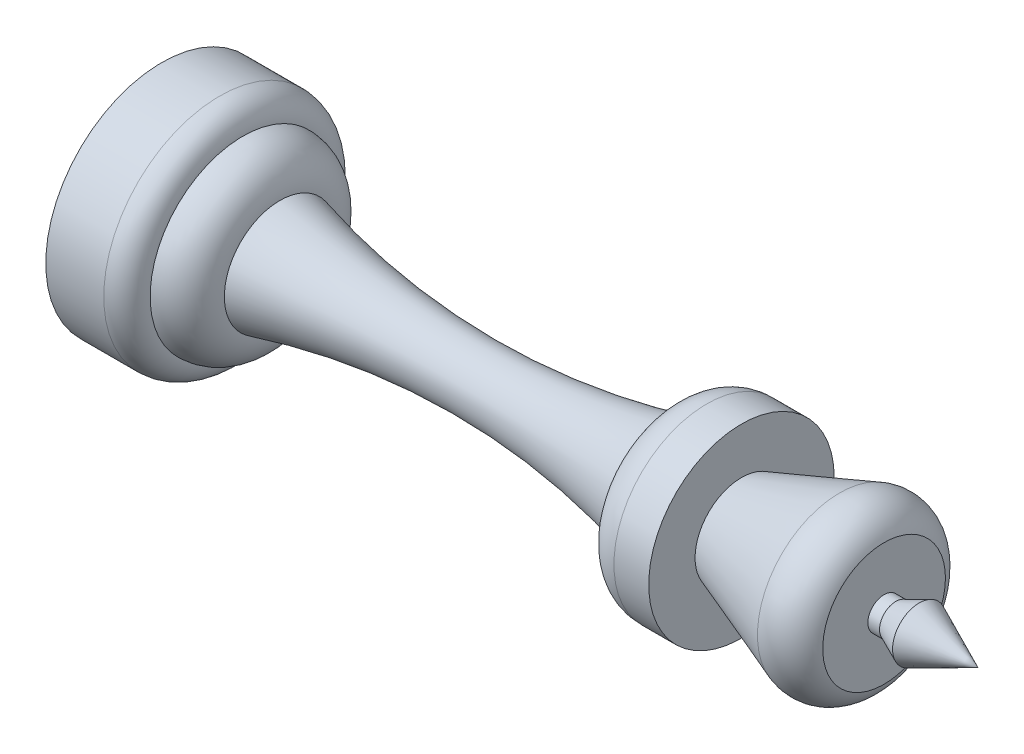
ISO-10303-21;
HEADER;
FILE_DESCRIPTION(('STEP AP214'),'2;1');
FILE_NAME('part.step','',(''),(''),'','','');
FILE_SCHEMA(('AUTOMOTIVE_DESIGN { 1 0 10303 214 1 1 1 1 }'));
ENDSEC;
DATA;
#1=APPLICATION_CONTEXT('core data for automotive mechanical design processes');
#2=APPLICATION_PROTOCOL_DEFINITION('international standard','automotive_design',2000,#1);
#3=PRODUCT_CONTEXT('',#1,'mechanical');
#4=PRODUCT('Part','Part','',(#3));
#5=PRODUCT_RELATED_PRODUCT_CATEGORY('part','',(#4));
#6=PRODUCT_DEFINITION_FORMATION('','',#4);
#7=PRODUCT_DEFINITION_CONTEXT('part definition',#1,'design');
#8=PRODUCT_DEFINITION('design','',#6,#7);
#9=PRODUCT_DEFINITION_SHAPE('','',#8);
#10=(LENGTH_UNIT() NAMED_UNIT(*) SI_UNIT(.MILLI.,.METRE.));
#11=(NAMED_UNIT(*) PLANE_ANGLE_UNIT() SI_UNIT($,.RADIAN.));
#12=(NAMED_UNIT(*) SI_UNIT($,.STERADIAN.) SOLID_ANGLE_UNIT());
#13=UNCERTAINTY_MEASURE_WITH_UNIT(LENGTH_MEASURE(1.E-05),#10,'distance_accuracy_value','');
#14=(GEOMETRIC_REPRESENTATION_CONTEXT(3) GLOBAL_UNCERTAINTY_ASSIGNED_CONTEXT((#13)) GLOBAL_UNIT_ASSIGNED_CONTEXT((#10,
#11,#12)) REPRESENTATION_CONTEXT('',''));
#15=CARTESIAN_POINT('',(0.,0.,0.));
#16=DIRECTION('',(0.,0.,1.));
#17=DIRECTION('',(1.,0.,0.));
#18=AXIS2_PLACEMENT_3D('',#15,#16,#17);
#19=CARTESIAN_POINT('',(7.,0.,0.));
#20=DIRECTION('',(1.,0.,0.));
#21=DIRECTION('',(0.,0.,-1.));
#22=AXIS2_PLACEMENT_3D('',#19,#20,#21);
#23=TOROIDAL_SURFACE('',#22,4.8,3.2);
#24=CARTESIAN_POINT('',(10.2,0.,0.));
#25=DIRECTION('',(1.,0.,0.));
#26=DIRECTION('',(0.,0.,-1.));
#27=AXIS2_PLACEMENT_3D('',#24,#25,#26);
#28=CIRCLE('',#27,4.8);
#29=CARTESIAN_POINT('',(10.2,0.,-4.8));
#30=VERTEX_POINT('',#29);
#31=EDGE_CURVE('E57',#30,#30,#28,.T.);
#32=ORIENTED_EDGE('',*,*,#31,.F.);
#33=EDGE_LOOP('',(#32));
#34=FACE_BOUND('',#33,.T.);
#35=CARTESIAN_POINT('',(7.,0.,0.));
#36=DIRECTION('',(1.,0.,0.));
#37=DIRECTION('',(0.,0.,-1.));
#38=AXIS2_PLACEMENT_3D('',#35,#36,#37);
#39=CIRCLE('',#38,8.);
#40=CARTESIAN_POINT('',(7.,0.,-8.));
#41=VERTEX_POINT('',#40);
#42=EDGE_CURVE('E111',#41,#41,#39,.T.);
#43=ORIENTED_EDGE('',*,*,#42,.T.);
#44=EDGE_LOOP('',(#43));
#45=FACE_BOUND('',#44,.T.);
#46=ADVANCED_FACE('F48',(#34,#45),#23,.T.);
#47=CARTESIAN_POINT('',(5.,0.,0.));
#48=DIRECTION('',(1.,0.,0.));
#49=DIRECTION('',(0.,0.,-1.));
#50=AXIS2_PLACEMENT_3D('',#47,#48,#49);
#51=TOROIDAL_SURFACE('',#50,8.,2.);
#52=ORIENTED_EDGE('',*,*,#42,.F.);
#53=EDGE_LOOP('',(#52));
#54=FACE_BOUND('',#53,.T.);
#55=CARTESIAN_POINT('',(5.,0.,0.));
#56=DIRECTION('',(1.,0.,0.));
#57=DIRECTION('',(0.,0.,-1.));
#58=AXIS2_PLACEMENT_3D('',#55,#56,#57);
#59=CIRCLE('',#58,10.);
#60=CARTESIAN_POINT('',(5.,0.,-10.));
#61=VERTEX_POINT('',#60);
#62=EDGE_CURVE('E107',#61,#61,#59,.T.);
#63=ORIENTED_EDGE('',*,*,#62,.T.);
#64=EDGE_LOOP('',(#63));
#65=FACE_BOUND('',#64,.T.);
#66=ADVANCED_FACE('F121',(#54,#65),#51,.T.);
#67=CARTESIAN_POINT('',(5.,0.,0.));
#68=DIRECTION('',(1.,0.,0.));
#69=DIRECTION('',(0.,0.,-1.));
#70=AXIS2_PLACEMENT_3D('',#67,#68,#69);
#71=CYLINDRICAL_SURFACE('',#70,10.);
#72=ORIENTED_EDGE('',*,*,#62,.F.);
#73=EDGE_LOOP('',(#72));
#74=FACE_BOUND('',#73,.T.);
#75=CARTESIAN_POINT('',(0.,0.,0.));
#76=DIRECTION('',(1.,0.,0.));
#77=DIRECTION('',(0.,0.,-1.));
#78=AXIS2_PLACEMENT_3D('',#75,#76,#77);
#79=CIRCLE('',#78,10.);
#80=CARTESIAN_POINT('',(0.,0.,-10.));
#81=VERTEX_POINT('',#80);
#82=EDGE_CURVE('E103',#81,#81,#79,.T.);
#83=ORIENTED_EDGE('',*,*,#82,.T.);
#84=EDGE_LOOP('',(#83));
#85=FACE_BOUND('',#84,.T.);
#86=ADVANCED_FACE('F127',(#74,#85),#71,.T.);
#87=CARTESIAN_POINT('',(0.,0.,0.));
#88=DIRECTION('',(1.,0.,0.));
#89=DIRECTION('',(0.,0.,-1.));
#90=AXIS2_PLACEMENT_3D('',#87,#88,#89);
#91=PLANE('',#90);
#92=ORIENTED_EDGE('',*,*,#82,.F.);
#93=EDGE_LOOP('',(#92));
#94=FACE_BOUND('',#93,.T.);
#95=ADVANCED_FACE('F133',(#94),#91,.F.);
#96=CARTESIAN_POINT('',(59.4832940170502,0.,0.));
#97=DIRECTION('',(1.,0.,0.));
#98=DIRECTION('',(0.,0.,-1.));
#99=AXIS2_PLACEMENT_3D('',#96,#97,#98);
#100=TOROIDAL_SURFACE('',#99,4.25910342757333,3.);
#101=CARTESIAN_POINT('',(62.3,0.,0.));
#102=DIRECTION('',(1.,0.,0.));
#103=DIRECTION('',(0.,0.,-1.));
#104=AXIS2_PLACEMENT_3D('',#101,#102,#103);
#105=CIRCLE('',#104,5.29165725455507);
#106=CARTESIAN_POINT('',(62.3,0.,-5.29165725455507));
#107=VERTEX_POINT('',#106);
#108=EDGE_CURVE('E274',#107,#107,#105,.T.);
#109=ORIENTED_EDGE('',*,*,#108,.F.);
#110=EDGE_LOOP('',(#109));
#111=FACE_BOUND('',#110,.T.);
#112=CARTESIAN_POINT('',(58.4572335870732,0.,0.));
#113=DIRECTION('',(1.,0.,0.));
#114=DIRECTION('',(0.,0.,-1.));
#115=AXIS2_PLACEMENT_3D('',#112,#113,#114);
#116=CIRCLE('',#115,7.07818128993106);
#117=CARTESIAN_POINT('',(58.4572335870732,0.,-7.07818128993106));
#118=VERTEX_POINT('',#117);
#119=EDGE_CURVE('E95',#118,#118,#116,.T.);
#120=ORIENTED_EDGE('',*,*,#119,.T.);
#121=EDGE_LOOP('',(#120));
#122=FACE_BOUND('',#121,.T.);
#123=ADVANCED_FACE('F138',(#111,#122),#100,.T.);
#124=CARTESIAN_POINT('',(50.,0.,0.));
#125=DIRECTION('',(1.,0.,0.));
#126=DIRECTION('',(0.,0.,-1.));
#127=AXIS2_PLACEMENT_3D('',#124,#125,#126);
#128=CONICAL_SURFACE('',#127,4.,0.34906585039887);
#129=ORIENTED_EDGE('',*,*,#119,.F.);
#130=EDGE_LOOP('',(#129));
#131=FACE_BOUND('',#130,.T.);
#132=CARTESIAN_POINT('',(50.,0.,0.));
#133=DIRECTION('',(1.,0.,0.));
#134=DIRECTION('',(0.,0.,-1.));
#135=AXIS2_PLACEMENT_3D('',#132,#133,#134);
#136=CIRCLE('',#135,4.);
#137=CARTESIAN_POINT('',(50.,0.,-4.));
#138=VERTEX_POINT('',#137);
#139=EDGE_CURVE('E91',#138,#138,#136,.T.);
#140=ORIENTED_EDGE('',*,*,#139,.T.);
#141=EDGE_LOOP('',(#140));
#142=FACE_BOUND('',#141,.T.);
#143=ADVANCED_FACE('F144',(#131,#142),#128,.T.);
#144=CARTESIAN_POINT('',(50.,0.,0.));
#145=DIRECTION('',(-1.,0.,0.));
#146=DIRECTION('',(0.,0.,1.));
#147=AXIS2_PLACEMENT_3D('',#144,#145,#146);
#148=PLANE('',#147);
#149=ORIENTED_EDGE('',*,*,#139,.F.);
#150=EDGE_LOOP('',(#149));
#151=FACE_BOUND('',#150,.T.);
#152=CARTESIAN_POINT('',(50.,0.,0.));
#153=DIRECTION('',(1.,0.,0.));
#154=DIRECTION('',(0.,0.,-1.));
#155=AXIS2_PLACEMENT_3D('',#152,#153,#154);
#156=CIRCLE('',#155,8.);
#157=CARTESIAN_POINT('',(50.,0.,-8.));
#158=VERTEX_POINT('',#157);
#159=EDGE_CURVE('E87',#158,#158,#156,.T.);
#160=ORIENTED_EDGE('',*,*,#159,.T.);
#161=EDGE_LOOP('',(#160));
#162=FACE_BOUND('',#161,.T.);
#163=ADVANCED_FACE('F193',(#151,#162),#148,.F.);
#164=CARTESIAN_POINT('',(50.,0.,0.));
#165=DIRECTION('',(1.,0.,0.));
#166=DIRECTION('',(0.,0.,-1.));
#167=AXIS2_PLACEMENT_3D('',#164,#165,#166);
#168=CYLINDRICAL_SURFACE('',#167,8.);
#169=ORIENTED_EDGE('',*,*,#159,.F.);
#170=EDGE_LOOP('',(#169));
#171=FACE_BOUND('',#170,.T.);
#172=CARTESIAN_POINT('',(47.,0.,0.));
#173=DIRECTION('',(1.,0.,0.));
#174=DIRECTION('',(0.,0.,-1.));
#175=AXIS2_PLACEMENT_3D('',#172,#173,#174);
#176=CIRCLE('',#175,8.);
#177=CARTESIAN_POINT('',(47.,0.,-8.));
#178=VERTEX_POINT('',#177);
#179=EDGE_CURVE('E77',#178,#178,#176,.T.);
#180=ORIENTED_EDGE('',*,*,#179,.T.);
#181=EDGE_LOOP('',(#180));
#182=FACE_BOUND('',#181,.T.);
#183=ADVANCED_FACE('F203',(#171,#182),#168,.T.);
#184=CARTESIAN_POINT('',(47.,0.,0.));
#185=DIRECTION('',(1.,0.,0.));
#186=DIRECTION('',(0.,0.,-1.));
#187=AXIS2_PLACEMENT_3D('',#184,#185,#186);
#188=TOROIDAL_SURFACE('',#187,4.8,3.2);
#189=ORIENTED_EDGE('',*,*,#179,.F.);
#190=EDGE_LOOP('',(#189));
#191=FACE_BOUND('',#190,.T.);
#192=CARTESIAN_POINT('',(43.8,0.,0.));
#193=DIRECTION('',(1.,0.,0.));
#194=DIRECTION('',(0.,0.,-1.));
#195=AXIS2_PLACEMENT_3D('',#192,#193,#194);
#196=CIRCLE('',#195,4.8);
#197=CARTESIAN_POINT('',(43.8,0.,-4.8));
#198=VERTEX_POINT('',#197);
#199=EDGE_CURVE('E71',#198,#198,#196,.T.);
#200=ORIENTED_EDGE('',*,*,#199,.T.);
#201=EDGE_LOOP('',(#200));
#202=FACE_BOUND('',#201,.T.);
#203=ADVANCED_FACE('F213',(#191,#202),#188,.T.);
#204=CARTESIAN_POINT('',(27.,0.,0.));
#205=DIRECTION('',(1.,0.,0.));
#206=DIRECTION('',(0.,0.,-1.));
#207=AXIS2_PLACEMENT_3D('',#204,#205,#206);
#208=TOROIDAL_SURFACE('',#207,67.5914006851257,65.);
#209=ORIENTED_EDGE('',*,*,#199,.F.);
#210=EDGE_LOOP('',(#209));
#211=FACE_BOUND('',#210,.T.);
#212=ORIENTED_EDGE('',*,*,#31,.T.);
#213=EDGE_LOOP('',(#212));
#214=FACE_BOUND('',#213,.T.);
#215=ADVANCED_FACE('F64',(#211,#214),#208,.F.);
#216=CARTESIAN_POINT('',(65.3311569267929,0.,0.));
#217=DIRECTION('',(-1.,0.,0.));
#218=DIRECTION('',(0.,0.,1.));
#219=AXIS2_PLACEMENT_3D('',#216,#217,#218);
#220=CONICAL_SURFACE('',#219,2.3,0.425970086765243);
#221=CARTESIAN_POINT('',(70.4,0.,0.));
#222=VERTEX_POINT('',#221);
#223=VERTEX_LOOP('',#222);
#224=FACE_BOUND('',#223,.T.);
#225=CARTESIAN_POINT('',(65.3311569267929,0.,0.));
#226=DIRECTION('',(1.,0.,0.));
#227=DIRECTION('',(0.,0.,-1.));
#228=AXIS2_PLACEMENT_3D('',#225,#226,#227);
#229=CIRCLE('',#228,2.3);
#230=CARTESIAN_POINT('',(65.3311569267929,0.,-2.3));
#231=VERTEX_POINT('',#230);
#232=EDGE_CURVE('E68',#231,#231,#229,.T.);
#233=ORIENTED_EDGE('',*,*,#232,.T.);
#234=EDGE_LOOP('',(#233));
#235=FACE_BOUND('',#234,.T.);
#236=ADVANCED_FACE('F60',(#224,#235),#220,.T.);
#237=CARTESIAN_POINT('',(63.3068784197077,0.,0.));
#238=DIRECTION('',(1.,0.,0.));
#239=DIRECTION('',(0.,0.,-1.));
#240=AXIS2_PLACEMENT_3D('',#237,#238,#239);
#241=CONICAL_SURFACE('',#240,1.4,0.418356601310738);
#242=ORIENTED_EDGE('',*,*,#232,.F.);
#243=EDGE_LOOP('',(#242));
#244=FACE_BOUND('',#243,.T.);
#245=CARTESIAN_POINT('',(63.3068784197077,0.,0.));
#246=DIRECTION('',(1.,0.,0.));
#247=DIRECTION('',(0.,0.,-1.));
#248=AXIS2_PLACEMENT_3D('',#245,#246,#247);
#249=CIRCLE('',#248,1.4);
#250=CARTESIAN_POINT('',(63.3068784197077,0.,-1.4));
#251=VERTEX_POINT('',#250);
#252=EDGE_CURVE('E72',#251,#251,#249,.T.);
#253=ORIENTED_EDGE('',*,*,#252,.T.);
#254=EDGE_LOOP('',(#253));
#255=FACE_BOUND('',#254,.T.);
#256=ADVANCED_FACE('F63',(#244,#255),#241,.T.);
#257=CARTESIAN_POINT('',(50.,0.,0.));
#258=DIRECTION('',(1.,0.,0.));
#259=DIRECTION('',(0.,0.,-1.));
#260=AXIS2_PLACEMENT_3D('',#257,#258,#259);
#261=CYLINDRICAL_SURFACE('',#260,1.4);
#262=ORIENTED_EDGE('',*,*,#252,.F.);
#263=EDGE_LOOP('',(#262));
#264=FACE_BOUND('',#263,.T.);
#265=CARTESIAN_POINT('',(62.3,0.,0.));
#266=DIRECTION('',(1.,0.,0.));
#267=DIRECTION('',(0.,0.,-1.));
#268=AXIS2_PLACEMENT_3D('',#265,#266,#267);
#269=CIRCLE('',#268,1.4);
#270=CARTESIAN_POINT('',(62.3,0.,-1.4));
#271=VERTEX_POINT('',#270);
#272=EDGE_CURVE('E80',#271,#271,#269,.T.);
#273=ORIENTED_EDGE('',*,*,#272,.T.);
#274=EDGE_LOOP('',(#273));
#275=FACE_BOUND('',#274,.T.);
#276=ADVANCED_FACE('F247',(#264,#275),#261,.T.);
#277=CARTESIAN_POINT('',(62.3,0.,0.));
#278=DIRECTION('',(-1.,0.,0.));
#279=DIRECTION('',(0.,0.,1.));
#280=AXIS2_PLACEMENT_3D('',#277,#278,#279);
#281=PLANE('',#280);
#282=ORIENTED_EDGE('',*,*,#272,.F.);
#283=EDGE_LOOP('',(#282));
#284=FACE_BOUND('',#283,.T.);
#285=ORIENTED_EDGE('',*,*,#108,.T.);
#286=EDGE_LOOP('',(#285));
#287=FACE_BOUND('',#286,.T.);
#288=ADVANCED_FACE('F256',(#284,#287),#281,.F.);
#289=CLOSED_SHELL('',(#46,#66,#86,#95,#123,#143,#163,#183,#203,#215,#236,#256,#276,#288));
#290=CARTESIAN_POINT('',(5.,0.,0.));
#291=DIRECTION('',(1.,0.,0.));
#292=DIRECTION('',(0.,0.,-1.));
#293=AXIS2_PLACEMENT_3D('',#290,#291,#292);
#294=CYLINDRICAL_SURFACE('',#293,5.25);
#295=CARTESIAN_POINT('',(3.5,0.,0.));
#296=DIRECTION('',(1.,0.,0.));
#297=DIRECTION('',(0.,0.,-1.));
#298=AXIS2_PLACEMENT_3D('',#295,#296,#297);
#299=CIRCLE('',#298,5.25);
#300=CARTESIAN_POINT('',(3.5,0.,-5.25));
#301=VERTEX_POINT('',#300);
#302=EDGE_CURVE('E11',#301,#301,#299,.T.);
#303=ORIENTED_EDGE('',*,*,#302,.T.);
#304=EDGE_LOOP('',(#303));
#305=FACE_BOUND('',#304,.T.);
#306=CARTESIAN_POINT('',(1.,0.,0.));
#307=DIRECTION('',(1.,0.,0.));
#308=DIRECTION('',(0.,0.,-1.));
#309=AXIS2_PLACEMENT_3D('',#306,#307,#308);
#310=CIRCLE('',#309,5.25);
#311=CARTESIAN_POINT('',(1.,0.,-5.25));
#312=VERTEX_POINT('',#311);
#313=EDGE_CURVE('E99',#312,#312,#310,.T.);
#314=ORIENTED_EDGE('',*,*,#313,.F.);
#315=EDGE_LOOP('',(#314));
#316=FACE_BOUND('',#315,.T.);
#317=ADVANCED_FACE('F50',(#305,#316),#294,.F.);
#318=CARTESIAN_POINT('',(3.5,0.,0.));
#319=DIRECTION('',(-1.,0.,0.));
#320=DIRECTION('',(0.,0.,1.));
#321=AXIS2_PLACEMENT_3D('',#318,#319,#320);
#322=PLANE('',#321);
#323=ORIENTED_EDGE('',*,*,#302,.F.);
#324=EDGE_LOOP('',(#323));
#325=FACE_BOUND('',#324,.T.);
#326=ADVANCED_FACE('F149',(#325),#322,.T.);
#327=CARTESIAN_POINT('',(1.,0.,0.));
#328=DIRECTION('',(1.,0.,0.));
#329=DIRECTION('',(0.,0.,-1.));
#330=AXIS2_PLACEMENT_3D('',#327,#328,#329);
#331=PLANE('',#330);
#332=ORIENTED_EDGE('',*,*,#313,.T.);
#333=EDGE_LOOP('',(#332));
#334=FACE_BOUND('',#333,.T.);
#335=ADVANCED_FACE('F148',(#334),#331,.T.);
#336=CLOSED_SHELL('',(#317,#326,#335));
#337=ORIENTED_CLOSED_SHELL('',*,#336,.T.);
#338=BREP_WITH_VOIDS('B2',#289,(#337));
#339=ADVANCED_BREP_SHAPE_REPRESENTATION('',(#18,#338),#14);
#340=SHAPE_DEFINITION_REPRESENTATION(#9,#339);
ENDSEC;
END-ISO-10303-21;
